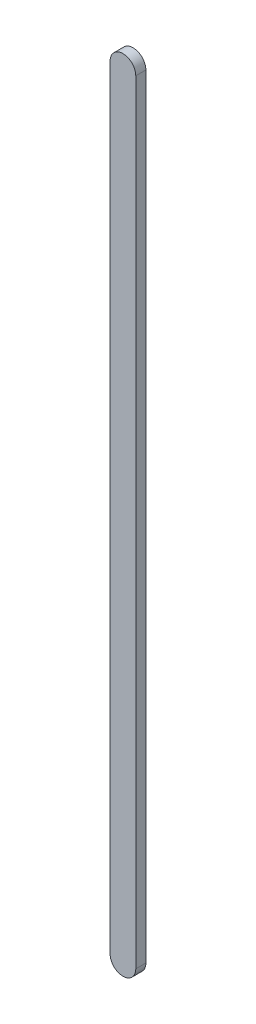
ISO-10303-21;
HEADER;
FILE_DESCRIPTION(('STEP AP214'),'2;1');
FILE_NAME('part.step','',(''),(''),'','','');
FILE_SCHEMA(('AUTOMOTIVE_DESIGN { 1 0 10303 214 1 1 1 1 }'));
ENDSEC;
DATA;
#1=APPLICATION_CONTEXT('core data for automotive mechanical design processes');
#2=APPLICATION_PROTOCOL_DEFINITION('international standard','automotive_design',2000,#1);
#3=PRODUCT_CONTEXT('',#1,'mechanical');
#4=PRODUCT('Part','Part','',(#3));
#5=PRODUCT_RELATED_PRODUCT_CATEGORY('part','',(#4));
#6=PRODUCT_DEFINITION_FORMATION('','',#4);
#7=PRODUCT_DEFINITION_CONTEXT('part definition',#1,'design');
#8=PRODUCT_DEFINITION('design','',#6,#7);
#9=PRODUCT_DEFINITION_SHAPE('','',#8);
#10=(LENGTH_UNIT() NAMED_UNIT(*) SI_UNIT(.MILLI.,.METRE.));
#11=(NAMED_UNIT(*) PLANE_ANGLE_UNIT() SI_UNIT($,.RADIAN.));
#12=(NAMED_UNIT(*) SI_UNIT($,.STERADIAN.) SOLID_ANGLE_UNIT());
#13=UNCERTAINTY_MEASURE_WITH_UNIT(LENGTH_MEASURE(1.E-05),#10,'distance_accuracy_value','');
#14=(GEOMETRIC_REPRESENTATION_CONTEXT(3) GLOBAL_UNCERTAINTY_ASSIGNED_CONTEXT((#13)) GLOBAL_UNIT_ASSIGNED_CONTEXT((#10,
#11,#12)) REPRESENTATION_CONTEXT('',''));
#15=CARTESIAN_POINT('',(0.,0.,0.));
#16=DIRECTION('',(0.,0.,1.));
#17=DIRECTION('',(1.,0.,0.));
#18=AXIS2_PLACEMENT_3D('',#15,#16,#17);
#19=CARTESIAN_POINT('',(109.22,103.759,0.));
#20=DIRECTION('',(-1.,0.,0.));
#21=DIRECTION('',(0.,1.,0.));
#22=AXIS2_PLACEMENT_3D('',#19,#20,#21);
#23=PLANE('',#22);
#24=DIRECTION('',(0.,1.,0.));
#25=VECTOR('',#24,1.);
#26=CARTESIAN_POINT('',(109.22,103.759,0.1999996));
#27=LINE('',#26,#25);
#28=CARTESIAN_POINT('',(109.22,103.759,0.1999996));
#29=VERTEX_POINT('',#28);
#30=CARTESIAN_POINT('',(109.22,119.0752,0.1999996));
#31=VERTEX_POINT('',#30);
#32=EDGE_CURVE('E11',#29,#31,#27,.T.);
#33=ORIENTED_EDGE('',*,*,#32,.F.);
#34=DIRECTION('',(0.,0.,1.));
#35=VECTOR('',#34,1.);
#36=CARTESIAN_POINT('',(109.22,103.759,0.));
#37=LINE('',#36,#35);
#38=CARTESIAN_POINT('',(109.22,103.759,0.));
#39=VERTEX_POINT('',#38);
#40=EDGE_CURVE('E24',#39,#29,#37,.T.);
#41=ORIENTED_EDGE('',*,*,#40,.F.);
#42=DIRECTION('',(0.,1.,0.));
#43=VECTOR('',#42,1.);
#44=CARTESIAN_POINT('',(109.22,103.759,0.));
#45=LINE('',#44,#43);
#46=CARTESIAN_POINT('',(109.22,119.0752,0.));
#47=VERTEX_POINT('',#46);
#48=EDGE_CURVE('E75',#39,#47,#45,.T.);
#49=ORIENTED_EDGE('',*,*,#48,.T.);
#50=DIRECTION('',(0.,0.,1.));
#51=VECTOR('',#50,1.);
#52=CARTESIAN_POINT('',(109.22,119.0752,0.));
#53=LINE('',#52,#51);
#54=EDGE_CURVE('E37',#47,#31,#53,.T.);
#55=ORIENTED_EDGE('',*,*,#54,.T.);
#56=EDGE_LOOP('',(#33,#41,#49,#55));
#57=FACE_BOUND('',#56,.T.);
#58=ADVANCED_FACE('F17',(#57),#23,.F.);
#59=CARTESIAN_POINT('',(108.966,119.0752,0.));
#60=DIRECTION('',(0.,0.,-1.));
#61=DIRECTION('',(1.,0.,0.));
#62=AXIS2_PLACEMENT_3D('',#59,#60,#61);
#63=CYLINDRICAL_SURFACE('',#62,0.253999999999995);
#64=CARTESIAN_POINT('',(108.966,119.0752,0.1999996));
#65=DIRECTION('',(0.,0.,1.));
#66=DIRECTION('',(1.,0.,0.));
#67=AXIS2_PLACEMENT_3D('',#64,#65,#66);
#68=CIRCLE('',#67,0.253999999999995);
#69=CARTESIAN_POINT('',(108.712,119.0752,0.1999996));
#70=VERTEX_POINT('',#69);
#71=EDGE_CURVE('E83',#31,#70,#68,.T.);
#72=ORIENTED_EDGE('',*,*,#71,.F.);
#73=ORIENTED_EDGE('',*,*,#54,.F.);
#74=CARTESIAN_POINT('',(108.966,119.0752,0.));
#75=DIRECTION('',(0.,0.,1.));
#76=DIRECTION('',(1.,0.,0.));
#77=AXIS2_PLACEMENT_3D('',#74,#75,#76);
#78=CIRCLE('',#77,0.253999999999995);
#79=CARTESIAN_POINT('',(108.712,119.0752,0.));
#80=VERTEX_POINT('',#79);
#81=EDGE_CURVE('E81',#47,#80,#78,.T.);
#82=ORIENTED_EDGE('',*,*,#81,.T.);
#83=DIRECTION('',(0.,0.,1.));
#84=VECTOR('',#83,1.);
#85=CARTESIAN_POINT('',(108.712,119.0752,0.));
#86=LINE('',#85,#84);
#87=EDGE_CURVE('E67',#80,#70,#86,.T.);
#88=ORIENTED_EDGE('',*,*,#87,.T.);
#89=EDGE_LOOP('',(#72,#73,#82,#88));
#90=FACE_BOUND('',#89,.T.);
#91=ADVANCED_FACE('F89',(#90),#63,.T.);
#92=CARTESIAN_POINT('',(108.712,119.0752,0.));
#93=DIRECTION('',(1.,0.,0.));
#94=DIRECTION('',(0.,-1.,0.));
#95=AXIS2_PLACEMENT_3D('',#92,#93,#94);
#96=PLANE('',#95);
#97=DIRECTION('',(0.,-1.,0.));
#98=VECTOR('',#97,1.);
#99=CARTESIAN_POINT('',(108.712,119.0752,0.1999996));
#100=LINE('',#99,#98);
#101=CARTESIAN_POINT('',(108.712,103.759,0.1999996));
#102=VERTEX_POINT('',#101);
#103=EDGE_CURVE('E71',#70,#102,#100,.T.);
#104=ORIENTED_EDGE('',*,*,#103,.F.);
#105=ORIENTED_EDGE('',*,*,#87,.F.);
#106=DIRECTION('',(0.,-1.,0.));
#107=VECTOR('',#106,1.);
#108=CARTESIAN_POINT('',(108.712,119.0752,0.));
#109=LINE('',#108,#107);
#110=CARTESIAN_POINT('',(108.712,103.759,0.));
#111=VERTEX_POINT('',#110);
#112=EDGE_CURVE('E63',#80,#111,#109,.T.);
#113=ORIENTED_EDGE('',*,*,#112,.T.);
#114=DIRECTION('',(0.,0.,1.));
#115=VECTOR('',#114,1.);
#116=CARTESIAN_POINT('',(108.712,103.759,0.));
#117=LINE('',#116,#115);
#118=EDGE_CURVE('E53',#111,#102,#117,.T.);
#119=ORIENTED_EDGE('',*,*,#118,.T.);
#120=EDGE_LOOP('',(#104,#105,#113,#119));
#121=FACE_BOUND('',#120,.T.);
#122=ADVANCED_FACE('F66',(#121),#96,.F.);
#123=CARTESIAN_POINT('',(108.966,103.759,0.));
#124=DIRECTION('',(0.,0.,-1.));
#125=DIRECTION('',(-1.,0.,0.));
#126=AXIS2_PLACEMENT_3D('',#123,#124,#125);
#127=CYLINDRICAL_SURFACE('',#126,0.254);
#128=CARTESIAN_POINT('',(108.966,103.759,0.1999996));
#129=DIRECTION('',(0.,0.,1.));
#130=DIRECTION('',(-1.,0.,0.));
#131=AXIS2_PLACEMENT_3D('',#128,#129,#130);
#132=CIRCLE('',#131,0.254);
#133=EDGE_CURVE('E59',#102,#29,#132,.T.);
#134=ORIENTED_EDGE('',*,*,#133,.F.);
#135=ORIENTED_EDGE('',*,*,#118,.F.);
#136=CARTESIAN_POINT('',(108.966,103.759,0.));
#137=DIRECTION('',(0.,0.,1.));
#138=DIRECTION('',(-1.,0.,0.));
#139=AXIS2_PLACEMENT_3D('',#136,#137,#138);
#140=CIRCLE('',#139,0.254);
#141=EDGE_CURVE('E57',#111,#39,#140,.T.);
#142=ORIENTED_EDGE('',*,*,#141,.T.);
#143=ORIENTED_EDGE('',*,*,#40,.T.);
#144=EDGE_LOOP('',(#134,#135,#142,#143));
#145=FACE_BOUND('',#144,.T.);
#146=ADVANCED_FACE('F55',(#145),#127,.T.);
#147=CARTESIAN_POINT('',(109.22,103.759,0.));
#148=DIRECTION('',(0.,0.,-1.));
#149=DIRECTION('',(-1.,0.,0.));
#150=AXIS2_PLACEMENT_3D('',#147,#148,#149);
#151=PLANE('',#150);
#152=ORIENTED_EDGE('',*,*,#141,.F.);
#153=ORIENTED_EDGE('',*,*,#112,.F.);
#154=ORIENTED_EDGE('',*,*,#81,.F.);
#155=ORIENTED_EDGE('',*,*,#48,.F.);
#156=EDGE_LOOP('',(#152,#153,#154,#155));
#157=FACE_BOUND('',#156,.T.);
#158=ADVANCED_FACE('F74',(#157),#151,.T.);
#159=CARTESIAN_POINT('',(109.22,103.759,0.1999996));
#160=DIRECTION('',(0.,0.,-1.));
#161=DIRECTION('',(-1.,0.,0.));
#162=AXIS2_PLACEMENT_3D('',#159,#160,#161);
#163=PLANE('',#162);
#164=ORIENTED_EDGE('',*,*,#32,.T.);
#165=ORIENTED_EDGE('',*,*,#71,.T.);
#166=ORIENTED_EDGE('',*,*,#103,.T.);
#167=ORIENTED_EDGE('',*,*,#133,.T.);
#168=EDGE_LOOP('',(#164,#165,#166,#167));
#169=FACE_BOUND('',#168,.T.);
#170=ADVANCED_FACE('F91',(#169),#163,.F.);
#171=CLOSED_SHELL('',(#58,#91,#122,#146,#158,#170));
#172=MANIFOLD_SOLID_BREP('B1',#171);
#173=ADVANCED_BREP_SHAPE_REPRESENTATION('',(#18,#172),#14);
#174=SHAPE_DEFINITION_REPRESENTATION(#9,#173);
ENDSEC;
END-ISO-10303-21;
